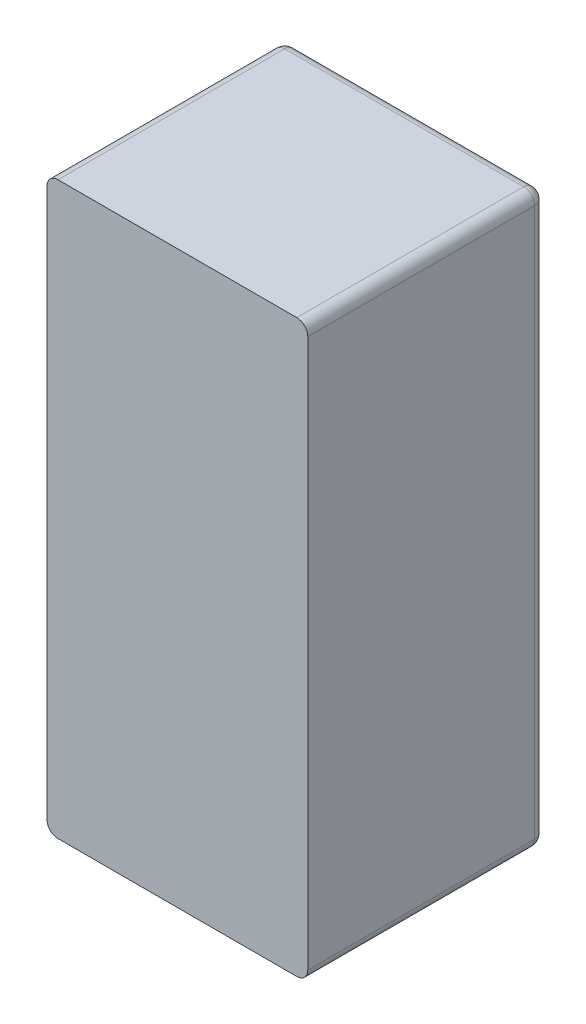
ISO-10303-21;
HEADER;
FILE_DESCRIPTION(('STEP AP214'),'2;1');
FILE_NAME('part.step','',(''),(''),'','','');
FILE_SCHEMA(('AUTOMOTIVE_DESIGN { 1 0 10303 214 1 1 1 1 }'));
ENDSEC;
DATA;
#1=APPLICATION_CONTEXT('core data for automotive mechanical design processes');
#2=APPLICATION_PROTOCOL_DEFINITION('international standard','automotive_design',2000,#1);
#3=PRODUCT_CONTEXT('',#1,'mechanical');
#4=PRODUCT('Part','Part','',(#3));
#5=PRODUCT_RELATED_PRODUCT_CATEGORY('part','',(#4));
#6=PRODUCT_DEFINITION_FORMATION('','',#4);
#7=PRODUCT_DEFINITION_CONTEXT('part definition',#1,'design');
#8=PRODUCT_DEFINITION('design','',#6,#7);
#9=PRODUCT_DEFINITION_SHAPE('','',#8);
#10=(LENGTH_UNIT() NAMED_UNIT(*) SI_UNIT(.MILLI.,.METRE.));
#11=(NAMED_UNIT(*) PLANE_ANGLE_UNIT() SI_UNIT($,.RADIAN.));
#12=(NAMED_UNIT(*) SI_UNIT($,.STERADIAN.) SOLID_ANGLE_UNIT());
#13=UNCERTAINTY_MEASURE_WITH_UNIT(LENGTH_MEASURE(1.E-05),#10,'distance_accuracy_value','');
#14=(GEOMETRIC_REPRESENTATION_CONTEXT(3) GLOBAL_UNCERTAINTY_ASSIGNED_CONTEXT((#13)) GLOBAL_UNIT_ASSIGNED_CONTEXT((#10,
#11,#12)) REPRESENTATION_CONTEXT('',''));
#15=CARTESIAN_POINT('',(0.,0.,0.));
#16=DIRECTION('',(0.,0.,1.));
#17=DIRECTION('',(1.,0.,0.));
#18=AXIS2_PLACEMENT_3D('',#15,#16,#17);
#19=CARTESIAN_POINT('',(118.999,260.35,-108.458));
#20=DIRECTION('',(-1.,0.,0.));
#21=DIRECTION('',(0.,0.,1.));
#22=AXIS2_PLACEMENT_3D('',#19,#20,#21);
#23=PLANE('',#22);
#24=DIRECTION('',(0.,-1.,0.));
#25=VECTOR('',#24,1.);
#26=CARTESIAN_POINT('',(118.999,260.35,-98.458));
#27=LINE('',#26,#25);
#28=CARTESIAN_POINT('',(118.999,-250.35,-98.458));
#29=VERTEX_POINT('',#28);
#30=CARTESIAN_POINT('',(118.999,250.35,-98.458));
#31=VERTEX_POINT('',#30);
#32=EDGE_CURVE('E124',#29,#31,#27,.F.);
#33=ORIENTED_EDGE('',*,*,#32,.T.);
#34=DIRECTION('',(0.,0.,-1.));
#35=VECTOR('',#34,1.);
#36=CARTESIAN_POINT('',(118.999,250.35,-108.458));
#37=LINE('',#36,#35);
#38=CARTESIAN_POINT('',(118.999,250.35,108.458));
#39=VERTEX_POINT('',#38);
#40=EDGE_CURVE('E166',#31,#39,#37,.F.);
#41=ORIENTED_EDGE('',*,*,#40,.T.);
#42=DIRECTION('',(0.,-1.,0.));
#43=VECTOR('',#42,1.);
#44=CARTESIAN_POINT('',(118.999,260.35,108.458));
#45=LINE('',#44,#43);
#46=CARTESIAN_POINT('',(118.999,-250.35,108.458));
#47=VERTEX_POINT('',#46);
#48=EDGE_CURVE('E244',#39,#47,#45,.T.);
#49=ORIENTED_EDGE('',*,*,#48,.T.);
#50=DIRECTION('',(0.,0.,-1.));
#51=VECTOR('',#50,1.);
#52=CARTESIAN_POINT('',(118.999,-250.35,-108.458));
#53=LINE('',#52,#51);
#54=EDGE_CURVE('E156',#47,#29,#53,.T.);
#55=ORIENTED_EDGE('',*,*,#54,.T.);
#56=EDGE_LOOP('',(#33,#41,#49,#55));
#57=FACE_BOUND('',#56,.T.);
#58=ADVANCED_FACE('F38',(#57),#23,.F.);
#59=CARTESIAN_POINT('',(118.999,260.35,-108.458));
#60=DIRECTION('',(0.,0.,1.));
#61=DIRECTION('',(1.,0.,0.));
#62=AXIS2_PLACEMENT_3D('',#59,#60,#61);
#63=PLANE('',#62);
#64=DIRECTION('',(-1.,0.,0.));
#65=VECTOR('',#64,1.);
#66=CARTESIAN_POINT('',(118.999,250.35,-108.458));
#67=LINE('',#66,#65);
#68=CARTESIAN_POINT('',(-108.999,250.35,-108.458));
#69=VERTEX_POINT('',#68);
#70=CARTESIAN_POINT('',(108.999,250.35,-108.458));
#71=VERTEX_POINT('',#70);
#72=EDGE_CURVE('E153',#69,#71,#67,.F.);
#73=ORIENTED_EDGE('',*,*,#72,.T.);
#74=DIRECTION('',(0.,-1.,0.));
#75=VECTOR('',#74,1.);
#76=CARTESIAN_POINT('',(108.999,260.35,-108.458));
#77=LINE('',#76,#75);
#78=CARTESIAN_POINT('',(108.999,-250.35,-108.458));
#79=VERTEX_POINT('',#78);
#80=EDGE_CURVE('E122',#71,#79,#77,.T.);
#81=ORIENTED_EDGE('',*,*,#80,.T.);
#82=DIRECTION('',(-1.,0.,0.));
#83=VECTOR('',#82,1.);
#84=CARTESIAN_POINT('',(-118.999,-250.35,-108.458));
#85=LINE('',#84,#83);
#86=CARTESIAN_POINT('',(-108.999,-250.35,-108.458));
#87=VERTEX_POINT('',#86);
#88=EDGE_CURVE('E141',#79,#87,#85,.T.);
#89=ORIENTED_EDGE('',*,*,#88,.T.);
#90=DIRECTION('',(0.,-1.,0.));
#91=VECTOR('',#90,1.);
#92=CARTESIAN_POINT('',(-108.999,260.35,-108.458));
#93=LINE('',#92,#91);
#94=EDGE_CURVE('E148',#87,#69,#93,.F.);
#95=ORIENTED_EDGE('',*,*,#94,.T.);
#96=EDGE_LOOP('',(#73,#81,#89,#95));
#97=FACE_BOUND('',#96,.T.);
#98=ADVANCED_FACE('F151',(#97),#63,.F.);
#99=CARTESIAN_POINT('',(-118.999,260.35,-108.458));
#100=DIRECTION('',(1.,0.,0.));
#101=DIRECTION('',(0.,0.,-1.));
#102=AXIS2_PLACEMENT_3D('',#99,#100,#101);
#103=PLANE('',#102);
#104=DIRECTION('',(0.,-1.,0.));
#105=VECTOR('',#104,1.);
#106=CARTESIAN_POINT('',(-118.999,260.35,108.458));
#107=LINE('',#106,#105);
#108=CARTESIAN_POINT('',(-118.999,250.35,108.458));
#109=VERTEX_POINT('',#108);
#110=CARTESIAN_POINT('',(-118.999,-250.35,108.458));
#111=VERTEX_POINT('',#110);
#112=EDGE_CURVE('E149',#109,#111,#107,.T.);
#113=ORIENTED_EDGE('',*,*,#112,.F.);
#114=DIRECTION('',(0.,0.,1.));
#115=VECTOR('',#114,1.);
#116=CARTESIAN_POINT('',(-118.999,250.35,-108.458));
#117=LINE('',#116,#115);
#118=CARTESIAN_POINT('',(-118.999,250.35,-98.4579999999999));
#119=VERTEX_POINT('',#118);
#120=EDGE_CURVE('E184',#109,#119,#117,.F.);
#121=ORIENTED_EDGE('',*,*,#120,.T.);
#122=DIRECTION('',(0.,-1.,0.));
#123=VECTOR('',#122,1.);
#124=CARTESIAN_POINT('',(-118.999,260.35,-98.4579999999999));
#125=LINE('',#124,#123);
#126=CARTESIAN_POINT('',(-118.999,-250.35,-98.4579999999999));
#127=VERTEX_POINT('',#126);
#128=EDGE_CURVE('E181',#119,#127,#125,.T.);
#129=ORIENTED_EDGE('',*,*,#128,.T.);
#130=DIRECTION('',(0.,0.,1.));
#131=VECTOR('',#130,1.);
#132=CARTESIAN_POINT('',(-118.999,-250.35,108.458));
#133=LINE('',#132,#131);
#134=EDGE_CURVE('E178',#127,#111,#133,.T.);
#135=ORIENTED_EDGE('',*,*,#134,.T.);
#136=EDGE_LOOP('',(#113,#121,#129,#135));
#137=FACE_BOUND('',#136,.T.);
#138=ADVANCED_FACE('F295',(#137),#103,.F.);
#139=CARTESIAN_POINT('',(118.999,260.35,108.458));
#140=DIRECTION('',(0.,0.,-1.));
#141=DIRECTION('',(-1.,0.,0.));
#142=AXIS2_PLACEMENT_3D('',#139,#140,#141);
#143=PLANE('',#142);
#144=DIRECTION('',(1.,0.,0.));
#145=VECTOR('',#144,1.);
#146=CARTESIAN_POINT('',(118.999,260.35,108.458));
#147=LINE('',#146,#145);
#148=CARTESIAN_POINT('',(-108.999,260.35,108.458));
#149=VERTEX_POINT('',#148);
#150=CARTESIAN_POINT('',(108.999,260.35,108.458));
#151=VERTEX_POINT('',#150);
#152=EDGE_CURVE('E238',#149,#151,#147,.T.);
#153=ORIENTED_EDGE('',*,*,#152,.F.);
#154=CARTESIAN_POINT('',(-108.999,250.35,108.458));
#155=DIRECTION('',(0.,0.,-1.));
#156=DIRECTION('',(-1.,0.,0.));
#157=AXIS2_PLACEMENT_3D('',#154,#155,#156);
#158=CIRCLE('',#157,10.);
#159=EDGE_CURVE('E11',#149,#109,#158,.F.);
#160=ORIENTED_EDGE('',*,*,#159,.T.);
#161=ORIENTED_EDGE('',*,*,#112,.T.);
#162=CARTESIAN_POINT('',(-108.999,-250.35,108.458));
#163=DIRECTION('',(0.,0.,-1.));
#164=DIRECTION('',(-1.,0.,0.));
#165=AXIS2_PLACEMENT_3D('',#162,#163,#164);
#166=CIRCLE('',#165,10.);
#167=CARTESIAN_POINT('',(-108.999,-260.35,108.458));
#168=VERTEX_POINT('',#167);
#169=EDGE_CURVE('E48',#111,#168,#166,.F.);
#170=ORIENTED_EDGE('',*,*,#169,.T.);
#171=DIRECTION('',(1.,0.,0.));
#172=VECTOR('',#171,1.);
#173=CARTESIAN_POINT('',(118.999,-260.35,108.458));
#174=LINE('',#173,#172);
#175=CARTESIAN_POINT('',(108.999,-260.35,108.458));
#176=VERTEX_POINT('',#175);
#177=EDGE_CURVE('E234',#168,#176,#174,.T.);
#178=ORIENTED_EDGE('',*,*,#177,.T.);
#179=CARTESIAN_POINT('',(108.999,-250.35,108.458));
#180=DIRECTION('',(0.,0.,-1.));
#181=DIRECTION('',(-1.,0.,0.));
#182=AXIS2_PLACEMENT_3D('',#179,#180,#181);
#183=CIRCLE('',#182,10.);
#184=EDGE_CURVE('E194',#176,#47,#183,.F.);
#185=ORIENTED_EDGE('',*,*,#184,.T.);
#186=ORIENTED_EDGE('',*,*,#48,.F.);
#187=CARTESIAN_POINT('',(108.999,250.35,108.458));
#188=DIRECTION('',(0.,0.,-1.));
#189=DIRECTION('',(-1.,0.,0.));
#190=AXIS2_PLACEMENT_3D('',#187,#188,#189);
#191=CIRCLE('',#190,10.);
#192=EDGE_CURVE('E197',#39,#151,#191,.F.);
#193=ORIENTED_EDGE('',*,*,#192,.T.);
#194=EDGE_LOOP('',(#153,#160,#161,#170,#178,#185,#186,#193));
#195=FACE_BOUND('',#194,.T.);
#196=ADVANCED_FACE('F388',(#195),#143,.F.);
#197=CARTESIAN_POINT('',(118.999,260.35,-108.458));
#198=DIRECTION('',(0.,-1.,0.));
#199=DIRECTION('',(0.,0.,-1.));
#200=AXIS2_PLACEMENT_3D('',#197,#198,#199);
#201=PLANE('',#200);
#202=DIRECTION('',(-1.,0.,0.));
#203=VECTOR('',#202,1.);
#204=CARTESIAN_POINT('',(118.999,260.35,-98.458));
#205=LINE('',#204,#203);
#206=CARTESIAN_POINT('',(108.999,260.35,-98.458));
#207=VERTEX_POINT('',#206);
#208=CARTESIAN_POINT('',(-108.999,260.35,-98.4579999999999));
#209=VERTEX_POINT('',#208);
#210=EDGE_CURVE('E172',#207,#209,#205,.T.);
#211=ORIENTED_EDGE('',*,*,#210,.T.);
#212=DIRECTION('',(0.,0.,1.));
#213=VECTOR('',#212,1.);
#214=CARTESIAN_POINT('',(-108.999,260.35,-108.458));
#215=LINE('',#214,#213);
#216=EDGE_CURVE('E175',#209,#149,#215,.T.);
#217=ORIENTED_EDGE('',*,*,#216,.T.);
#218=ORIENTED_EDGE('',*,*,#152,.T.);
#219=DIRECTION('',(0.,0.,-1.));
#220=VECTOR('',#219,1.);
#221=CARTESIAN_POINT('',(108.999,260.35,-108.458));
#222=LINE('',#221,#220);
#223=EDGE_CURVE('E169',#151,#207,#222,.T.);
#224=ORIENTED_EDGE('',*,*,#223,.T.);
#225=EDGE_LOOP('',(#211,#217,#218,#224));
#226=FACE_BOUND('',#225,.T.);
#227=ADVANCED_FACE('F380',(#226),#201,.F.);
#228=CARTESIAN_POINT('',(118.999,-260.35,-108.458));
#229=DIRECTION('',(0.,-1.,0.));
#230=DIRECTION('',(0.,0.,-1.));
#231=AXIS2_PLACEMENT_3D('',#228,#229,#230);
#232=PLANE('',#231);
#233=ORIENTED_EDGE('',*,*,#177,.F.);
#234=DIRECTION('',(0.,0.,1.));
#235=VECTOR('',#234,1.);
#236=CARTESIAN_POINT('',(-108.999,-260.35,-108.458));
#237=LINE('',#236,#235);
#238=CARTESIAN_POINT('',(-108.999,-260.35,-98.4579999999999));
#239=VERTEX_POINT('',#238);
#240=EDGE_CURVE('E56',#168,#239,#237,.F.);
#241=ORIENTED_EDGE('',*,*,#240,.T.);
#242=DIRECTION('',(-1.,0.,0.));
#243=VECTOR('',#242,1.);
#244=CARTESIAN_POINT('',(118.999,-260.35,-98.458));
#245=LINE('',#244,#243);
#246=CARTESIAN_POINT('',(108.999,-260.35,-98.458));
#247=VERTEX_POINT('',#246);
#248=EDGE_CURVE('E61',#239,#247,#245,.F.);
#249=ORIENTED_EDGE('',*,*,#248,.T.);
#250=DIRECTION('',(0.,0.,-1.));
#251=VECTOR('',#250,1.);
#252=CARTESIAN_POINT('',(108.999,-260.35,108.458));
#253=LINE('',#252,#251);
#254=EDGE_CURVE('E187',#247,#176,#253,.F.);
#255=ORIENTED_EDGE('',*,*,#254,.T.);
#256=EDGE_LOOP('',(#233,#241,#249,#255));
#257=FACE_BOUND('',#256,.T.);
#258=ADVANCED_FACE('F275',(#257),#232,.T.);
#259=CARTESIAN_POINT('',(-108.999,250.35,-108.458));
#260=DIRECTION('',(0.,0.,1.));
#261=DIRECTION('',(1.,0.,0.));
#262=AXIS2_PLACEMENT_3D('',#259,#260,#261);
#263=CYLINDRICAL_SURFACE('',#262,10.);
#264=ORIENTED_EDGE('',*,*,#159,.F.);
#265=ORIENTED_EDGE('',*,*,#216,.F.);
#266=CARTESIAN_POINT('',(-108.999,250.35,-98.4579999999999));
#267=DIRECTION('',(0.,0.,-1.));
#268=DIRECTION('',(-1.,0.,0.));
#269=AXIS2_PLACEMENT_3D('',#266,#267,#268);
#270=CIRCLE('',#269,10.);
#271=EDGE_CURVE('E42',#119,#209,#270,.T.);
#272=ORIENTED_EDGE('',*,*,#271,.F.);
#273=ORIENTED_EDGE('',*,*,#120,.F.);
#274=EDGE_LOOP('',(#264,#265,#272,#273));
#275=FACE_BOUND('',#274,.T.);
#276=ADVANCED_FACE('F40',(#275),#263,.T.);
#277=CARTESIAN_POINT('',(-108.999,260.35,-98.4579999999999));
#278=DIRECTION('',(0.,-1.,0.));
#279=DIRECTION('',(0.,0.,-1.));
#280=AXIS2_PLACEMENT_3D('',#277,#278,#279);
#281=CYLINDRICAL_SURFACE('',#280,10.);
#282=CARTESIAN_POINT('',(-108.999,-250.35,-98.4579999999999));
#283=DIRECTION('',(0.,-1.,0.));
#284=DIRECTION('',(0.,0.,-1.));
#285=AXIS2_PLACEMENT_3D('',#282,#283,#284);
#286=CIRCLE('',#285,10.);
#287=EDGE_CURVE('E223',#127,#87,#286,.T.);
#288=ORIENTED_EDGE('',*,*,#287,.F.);
#289=ORIENTED_EDGE('',*,*,#128,.F.);
#290=CARTESIAN_POINT('',(-108.999,250.35,-98.4579999999999));
#291=DIRECTION('',(0.,1.,0.));
#292=DIRECTION('',(0.,0.,1.));
#293=AXIS2_PLACEMENT_3D('',#290,#291,#292);
#294=CIRCLE('',#293,10.);
#295=EDGE_CURVE('E226',#69,#119,#294,.T.);
#296=ORIENTED_EDGE('',*,*,#295,.F.);
#297=ORIENTED_EDGE('',*,*,#94,.F.);
#298=EDGE_LOOP('',(#288,#289,#296,#297));
#299=FACE_BOUND('',#298,.T.);
#300=ADVANCED_FACE('F256',(#299),#281,.T.);
#301=CARTESIAN_POINT('',(-108.999,-250.35,-108.458));
#302=DIRECTION('',(0.,0.,-1.));
#303=DIRECTION('',(-1.,0.,0.));
#304=AXIS2_PLACEMENT_3D('',#301,#302,#303);
#305=CYLINDRICAL_SURFACE('',#304,10.);
#306=ORIENTED_EDGE('',*,*,#169,.F.);
#307=ORIENTED_EDGE('',*,*,#134,.F.);
#308=CARTESIAN_POINT('',(-108.999,-250.35,-98.4579999999999));
#309=DIRECTION('',(0.,0.,-1.));
#310=DIRECTION('',(-1.,0.,0.));
#311=AXIS2_PLACEMENT_3D('',#308,#309,#310);
#312=CIRCLE('',#311,10.);
#313=EDGE_CURVE('E219',#239,#127,#312,.T.);
#314=ORIENTED_EDGE('',*,*,#313,.F.);
#315=ORIENTED_EDGE('',*,*,#240,.F.);
#316=EDGE_LOOP('',(#306,#307,#314,#315));
#317=FACE_BOUND('',#316,.T.);
#318=ADVANCED_FACE('F278',(#317),#305,.T.);
#319=CARTESIAN_POINT('',(-108.999,250.35,-98.4579999999999));
#320=DIRECTION('',(-1.,0.,0.));
#321=DIRECTION('',(0.,0.,1.));
#322=AXIS2_PLACEMENT_3D('',#319,#320,#321);
#323=SPHERICAL_SURFACE('',#322,10.);
#324=ORIENTED_EDGE('',*,*,#295,.T.);
#325=ORIENTED_EDGE('',*,*,#271,.T.);
#326=CARTESIAN_POINT('',(-108.999,250.35,-98.4579999999999));
#327=DIRECTION('',(-1.,0.,0.));
#328=DIRECTION('',(0.,0.,1.));
#329=AXIS2_PLACEMENT_3D('',#326,#327,#328);
#330=CIRCLE('',#329,10.);
#331=EDGE_CURVE('E215',#69,#209,#330,.F.);
#332=ORIENTED_EDGE('',*,*,#331,.F.);
#333=EDGE_LOOP('',(#324,#325,#332));
#334=FACE_BOUND('',#333,.T.);
#335=ADVANCED_FACE('F257',(#334),#323,.T.);
#336=CARTESIAN_POINT('',(-108.999,-250.35,-98.4579999999999));
#337=DIRECTION('',(-1.,0.,0.));
#338=DIRECTION('',(0.,-1.,0.));
#339=AXIS2_PLACEMENT_3D('',#336,#337,#338);
#340=SPHERICAL_SURFACE('',#339,10.);
#341=ORIENTED_EDGE('',*,*,#313,.T.);
#342=ORIENTED_EDGE('',*,*,#287,.T.);
#343=CARTESIAN_POINT('',(-108.999,-250.35,-98.4579999999999));
#344=DIRECTION('',(-1.,0.,0.));
#345=DIRECTION('',(0.,0.,1.));
#346=AXIS2_PLACEMENT_3D('',#343,#344,#345);
#347=CIRCLE('',#346,10.);
#348=EDGE_CURVE('E144',#239,#87,#347,.F.);
#349=ORIENTED_EDGE('',*,*,#348,.F.);
#350=EDGE_LOOP('',(#341,#342,#349));
#351=FACE_BOUND('',#350,.T.);
#352=ADVANCED_FACE('F281',(#351),#340,.T.);
#353=CARTESIAN_POINT('',(108.999,250.35,-108.458));
#354=DIRECTION('',(0.,0.,-1.));
#355=DIRECTION('',(-1.,0.,0.));
#356=AXIS2_PLACEMENT_3D('',#353,#354,#355);
#357=CYLINDRICAL_SURFACE('',#356,10.);
#358=ORIENTED_EDGE('',*,*,#192,.F.);
#359=ORIENTED_EDGE('',*,*,#40,.F.);
#360=CARTESIAN_POINT('',(108.999,250.35,-98.458));
#361=DIRECTION('',(0.,0.,-1.));
#362=DIRECTION('',(-1.,0.,0.));
#363=AXIS2_PLACEMENT_3D('',#360,#361,#362);
#364=CIRCLE('',#363,10.);
#365=EDGE_CURVE('E209',#207,#31,#364,.T.);
#366=ORIENTED_EDGE('',*,*,#365,.F.);
#367=ORIENTED_EDGE('',*,*,#223,.F.);
#368=EDGE_LOOP('',(#358,#359,#366,#367));
#369=FACE_BOUND('',#368,.T.);
#370=ADVANCED_FACE('F269',(#369),#357,.T.);
#371=CARTESIAN_POINT('',(118.999,250.35,-98.458));
#372=DIRECTION('',(-1.,0.,0.));
#373=DIRECTION('',(0.,0.,1.));
#374=AXIS2_PLACEMENT_3D('',#371,#372,#373);
#375=CYLINDRICAL_SURFACE('',#374,10.);
#376=ORIENTED_EDGE('',*,*,#331,.T.);
#377=ORIENTED_EDGE('',*,*,#210,.F.);
#378=CARTESIAN_POINT('',(108.999,250.35,-98.458));
#379=DIRECTION('',(1.,0.,0.));
#380=DIRECTION('',(0.,0.,-1.));
#381=AXIS2_PLACEMENT_3D('',#378,#379,#380);
#382=CIRCLE('',#381,10.);
#383=EDGE_CURVE('E138',#71,#207,#382,.T.);
#384=ORIENTED_EDGE('',*,*,#383,.F.);
#385=ORIENTED_EDGE('',*,*,#72,.F.);
#386=EDGE_LOOP('',(#376,#377,#384,#385));
#387=FACE_BOUND('',#386,.T.);
#388=ADVANCED_FACE('F260',(#387),#375,.T.);
#389=CARTESIAN_POINT('',(118.999,-250.35,-98.458));
#390=DIRECTION('',(1.,0.,0.));
#391=DIRECTION('',(0.,0.,-1.));
#392=AXIS2_PLACEMENT_3D('',#389,#390,#391);
#393=CYLINDRICAL_SURFACE('',#392,10.);
#394=ORIENTED_EDGE('',*,*,#348,.T.);
#395=ORIENTED_EDGE('',*,*,#88,.F.);
#396=CARTESIAN_POINT('',(108.999,-250.35,-98.458));
#397=DIRECTION('',(1.,0.,0.));
#398=DIRECTION('',(0.,0.,-1.));
#399=AXIS2_PLACEMENT_3D('',#396,#397,#398);
#400=CIRCLE('',#399,10.);
#401=EDGE_CURVE('E131',#247,#79,#400,.T.);
#402=ORIENTED_EDGE('',*,*,#401,.F.);
#403=ORIENTED_EDGE('',*,*,#248,.F.);
#404=EDGE_LOOP('',(#394,#395,#402,#403));
#405=FACE_BOUND('',#404,.T.);
#406=ADVANCED_FACE('F142',(#405),#393,.T.);
#407=CARTESIAN_POINT('',(108.999,-250.35,-108.458));
#408=DIRECTION('',(0.,0.,1.));
#409=DIRECTION('',(1.,0.,0.));
#410=AXIS2_PLACEMENT_3D('',#407,#408,#409);
#411=CYLINDRICAL_SURFACE('',#410,10.);
#412=ORIENTED_EDGE('',*,*,#184,.F.);
#413=ORIENTED_EDGE('',*,*,#254,.F.);
#414=CARTESIAN_POINT('',(108.999,-250.35,-98.458));
#415=DIRECTION('',(0.,0.,-1.));
#416=DIRECTION('',(-1.,0.,0.));
#417=AXIS2_PLACEMENT_3D('',#414,#415,#416);
#418=CIRCLE('',#417,10.);
#419=EDGE_CURVE('E135',#29,#247,#418,.T.);
#420=ORIENTED_EDGE('',*,*,#419,.F.);
#421=ORIENTED_EDGE('',*,*,#54,.F.);
#422=EDGE_LOOP('',(#412,#413,#420,#421));
#423=FACE_BOUND('',#422,.T.);
#424=ADVANCED_FACE('F274',(#423),#411,.T.);
#425=CARTESIAN_POINT('',(108.999,250.35,-98.458));
#426=DIRECTION('',(0.,1.,0.));
#427=DIRECTION('',(0.,0.,1.));
#428=AXIS2_PLACEMENT_3D('',#425,#426,#427);
#429=SPHERICAL_SURFACE('',#428,10.);
#430=ORIENTED_EDGE('',*,*,#383,.T.);
#431=ORIENTED_EDGE('',*,*,#365,.T.);
#432=CARTESIAN_POINT('',(108.999,250.35,-98.458));
#433=DIRECTION('',(0.,1.,0.));
#434=DIRECTION('',(0.,0.,1.));
#435=AXIS2_PLACEMENT_3D('',#432,#433,#434);
#436=CIRCLE('',#435,10.);
#437=EDGE_CURVE('E128',#71,#31,#436,.F.);
#438=ORIENTED_EDGE('',*,*,#437,.F.);
#439=EDGE_LOOP('',(#430,#431,#438));
#440=FACE_BOUND('',#439,.T.);
#441=ADVANCED_FACE('F264',(#440),#429,.T.);
#442=CARTESIAN_POINT('',(108.999,-250.35,-98.458));
#443=DIRECTION('',(0.,-1.,0.));
#444=DIRECTION('',(0.,0.,-1.));
#445=AXIS2_PLACEMENT_3D('',#442,#443,#444);
#446=SPHERICAL_SURFACE('',#445,10.);
#447=ORIENTED_EDGE('',*,*,#419,.T.);
#448=ORIENTED_EDGE('',*,*,#401,.T.);
#449=CARTESIAN_POINT('',(108.999,-250.35,-98.458));
#450=DIRECTION('',(0.,-1.,0.));
#451=DIRECTION('',(0.,0.,-1.));
#452=AXIS2_PLACEMENT_3D('',#449,#450,#451);
#453=CIRCLE('',#452,10.);
#454=EDGE_CURVE('E118',#29,#79,#453,.F.);
#455=ORIENTED_EDGE('',*,*,#454,.F.);
#456=EDGE_LOOP('',(#447,#448,#455));
#457=FACE_BOUND('',#456,.T.);
#458=ADVANCED_FACE('F133',(#457),#446,.T.);
#459=CARTESIAN_POINT('',(108.999,260.35,-98.458));
#460=DIRECTION('',(0.,-1.,0.));
#461=DIRECTION('',(0.,0.,-1.));
#462=AXIS2_PLACEMENT_3D('',#459,#460,#461);
#463=CYLINDRICAL_SURFACE('',#462,10.);
#464=ORIENTED_EDGE('',*,*,#437,.T.);
#465=ORIENTED_EDGE('',*,*,#32,.F.);
#466=ORIENTED_EDGE('',*,*,#454,.T.);
#467=ORIENTED_EDGE('',*,*,#80,.F.);
#468=EDGE_LOOP('',(#464,#465,#466,#467));
#469=FACE_BOUND('',#468,.T.);
#470=ADVANCED_FACE('F120',(#469),#463,.T.);
#471=CLOSED_SHELL('',(#58,#98,#138,#196,#227,#258,#276,#300,#318,#335,#352,#370,#388,#406,#424,
#441,#458,#470));
#472=MANIFOLD_SOLID_BREP('B2',#471);
#473=ADVANCED_BREP_SHAPE_REPRESENTATION('',(#18,#472),#14);
#474=SHAPE_DEFINITION_REPRESENTATION(#9,#473);
ENDSEC;
END-ISO-10303-21;
